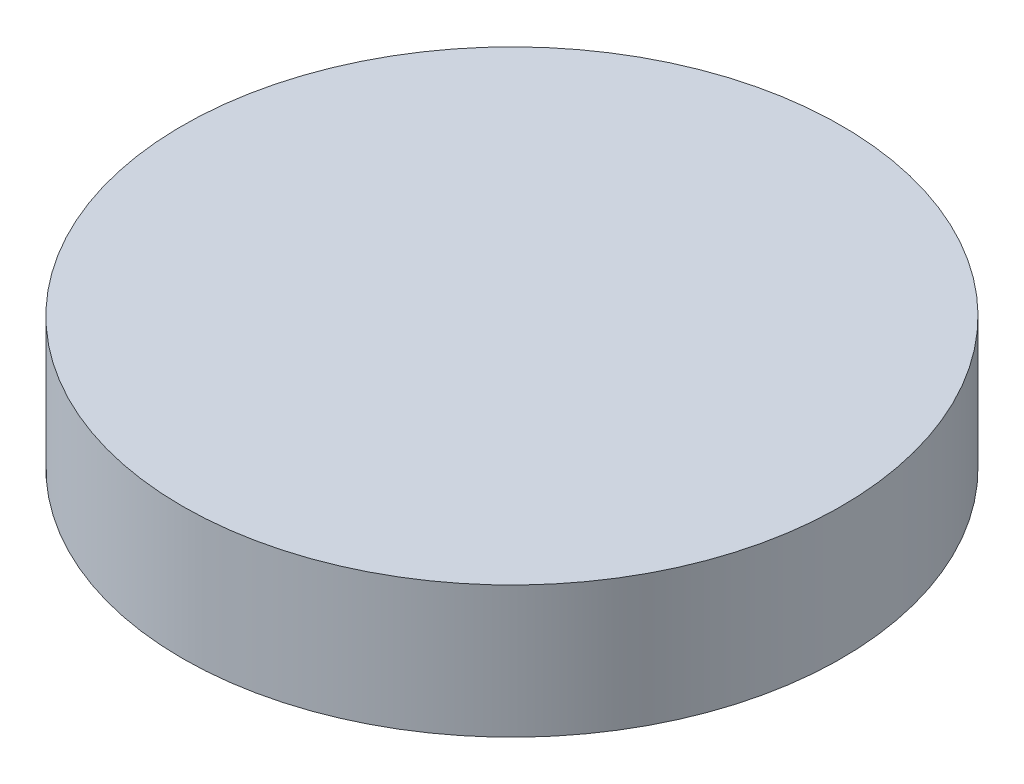
ISO-10303-21;
HEADER;
FILE_DESCRIPTION(('STEP AP214'),'2;1');
FILE_NAME('part.step','',(''),(''),'','','');
FILE_SCHEMA(('AUTOMOTIVE_DESIGN { 1 0 10303 214 1 1 1 1 }'));
ENDSEC;
DATA;
#1=APPLICATION_CONTEXT('core data for automotive mechanical design processes');
#2=APPLICATION_PROTOCOL_DEFINITION('international standard','automotive_design',2000,#1);
#3=PRODUCT_CONTEXT('',#1,'mechanical');
#4=PRODUCT('Part','Part','',(#3));
#5=PRODUCT_RELATED_PRODUCT_CATEGORY('part','',(#4));
#6=PRODUCT_DEFINITION_FORMATION('','',#4);
#7=PRODUCT_DEFINITION_CONTEXT('part definition',#1,'design');
#8=PRODUCT_DEFINITION('design','',#6,#7);
#9=PRODUCT_DEFINITION_SHAPE('','',#8);
#10=(LENGTH_UNIT() NAMED_UNIT(*) SI_UNIT(.MILLI.,.METRE.));
#11=(NAMED_UNIT(*) PLANE_ANGLE_UNIT() SI_UNIT($,.RADIAN.));
#12=(NAMED_UNIT(*) SI_UNIT($,.STERADIAN.) SOLID_ANGLE_UNIT());
#13=UNCERTAINTY_MEASURE_WITH_UNIT(LENGTH_MEASURE(1.E-05),#10,'distance_accuracy_value','');
#14=(GEOMETRIC_REPRESENTATION_CONTEXT(3) GLOBAL_UNCERTAINTY_ASSIGNED_CONTEXT((#13)) GLOBAL_UNIT_ASSIGNED_CONTEXT((#10,
#11,#12)) REPRESENTATION_CONTEXT('',''));
#15=CARTESIAN_POINT('',(0.,0.,0.));
#16=DIRECTION('',(0.,0.,1.));
#17=DIRECTION('',(1.,0.,0.));
#18=AXIS2_PLACEMENT_3D('',#15,#16,#17);
#19=CARTESIAN_POINT('',(0.,272.,-360.));
#20=DIRECTION('',(0.,-1.,0.));
#21=DIRECTION('',(0.,0.,-1.));
#22=AXIS2_PLACEMENT_3D('',#19,#20,#21);
#23=CYLINDRICAL_SURFACE('',#22,30.);
#24=CARTESIAN_POINT('',(0.,272.,-360.));
#25=DIRECTION('',(0.,1.,0.));
#26=DIRECTION('',(0.,0.,1.));
#27=AXIS2_PLACEMENT_3D('',#24,#25,#26);
#28=CIRCLE('',#27,30.);
#29=CARTESIAN_POINT('',(0.,272.,-330.));
#30=VERTEX_POINT('',#29);
#31=EDGE_CURVE('E10',#30,#30,#28,.T.);
#32=ORIENTED_EDGE('',*,*,#31,.F.);
#33=EDGE_LOOP('',(#32));
#34=FACE_BOUND('',#33,.T.);
#35=CARTESIAN_POINT('',(0.,260.,-360.));
#36=DIRECTION('',(0.,1.,0.));
#37=DIRECTION('',(0.,0.,1.));
#38=AXIS2_PLACEMENT_3D('',#35,#36,#37);
#39=CIRCLE('',#38,30.);
#40=CARTESIAN_POINT('',(0.,260.,-330.));
#41=VERTEX_POINT('',#40);
#42=EDGE_CURVE('E40',#41,#41,#39,.T.);
#43=ORIENTED_EDGE('',*,*,#42,.T.);
#44=EDGE_LOOP('',(#43));
#45=FACE_BOUND('',#44,.T.);
#46=ADVANCED_FACE('F37',(#34,#45),#23,.T.);
#47=CARTESIAN_POINT('',(0.,272.,-360.));
#48=DIRECTION('',(0.,1.,0.));
#49=DIRECTION('',(0.,0.,1.));
#50=AXIS2_PLACEMENT_3D('',#47,#48,#49);
#51=PLANE('',#50);
#52=ORIENTED_EDGE('',*,*,#31,.T.);
#53=EDGE_LOOP('',(#52));
#54=FACE_BOUND('',#53,.T.);
#55=ADVANCED_FACE('F52',(#54),#51,.T.);
#56=CARTESIAN_POINT('',(0.,260.,-360.));
#57=DIRECTION('',(0.,1.,0.));
#58=DIRECTION('',(0.,0.,1.));
#59=AXIS2_PLACEMENT_3D('',#56,#57,#58);
#60=PLANE('',#59);
#61=ORIENTED_EDGE('',*,*,#42,.F.);
#62=EDGE_LOOP('',(#61));
#63=FACE_BOUND('',#62,.T.);
#64=ADVANCED_FACE('F50',(#63),#60,.F.);
#65=CLOSED_SHELL('',(#46,#55,#64));
#66=MANIFOLD_SOLID_BREP('B2',#65);
#67=ADVANCED_BREP_SHAPE_REPRESENTATION('',(#18,#66),#14);
#68=SHAPE_DEFINITION_REPRESENTATION(#9,#67);
ENDSEC;
END-ISO-10303-21;
